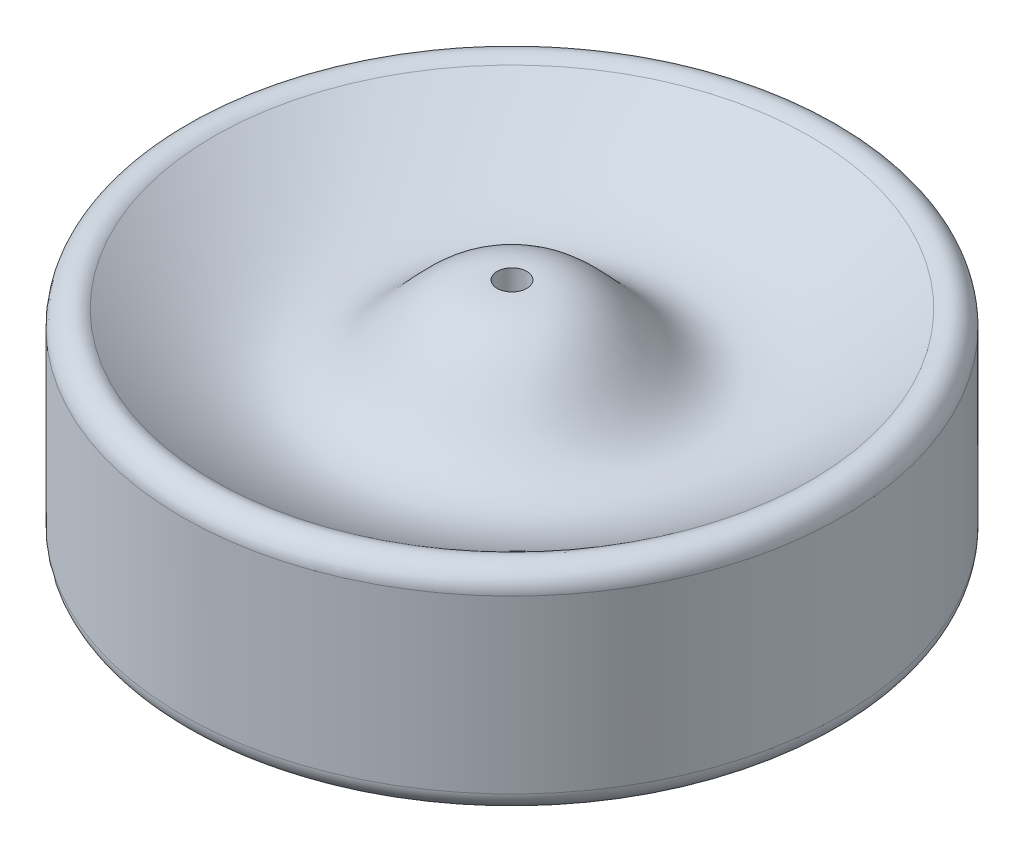
ISO-10303-21;
HEADER;
FILE_DESCRIPTION(('STEP AP214'),'2;1');
FILE_NAME('part.step','',(''),(''),'','','');
FILE_SCHEMA(('AUTOMOTIVE_DESIGN { 1 0 10303 214 1 1 1 1 }'));
ENDSEC;
DATA;
#1=APPLICATION_CONTEXT('core data for automotive mechanical design processes');
#2=APPLICATION_PROTOCOL_DEFINITION('international standard','automotive_design',2000,#1);
#3=PRODUCT_CONTEXT('',#1,'mechanical');
#4=PRODUCT('Part','Part','',(#3));
#5=PRODUCT_RELATED_PRODUCT_CATEGORY('part','',(#4));
#6=PRODUCT_DEFINITION_FORMATION('','',#4);
#7=PRODUCT_DEFINITION_CONTEXT('part definition',#1,'design');
#8=PRODUCT_DEFINITION('design','',#6,#7);
#9=PRODUCT_DEFINITION_SHAPE('','',#8);
#10=(LENGTH_UNIT() NAMED_UNIT(*) SI_UNIT(.MILLI.,.METRE.));
#11=(NAMED_UNIT(*) PLANE_ANGLE_UNIT() SI_UNIT($,.RADIAN.));
#12=(NAMED_UNIT(*) SI_UNIT($,.STERADIAN.) SOLID_ANGLE_UNIT());
#13=UNCERTAINTY_MEASURE_WITH_UNIT(LENGTH_MEASURE(1.E-05),#10,'distance_accuracy_value','');
#14=(GEOMETRIC_REPRESENTATION_CONTEXT(3) GLOBAL_UNCERTAINTY_ASSIGNED_CONTEXT((#13)) GLOBAL_UNIT_ASSIGNED_CONTEXT((#10,
#11,#12)) REPRESENTATION_CONTEXT('',''));
#15=CARTESIAN_POINT('',(0.,0.,0.));
#16=DIRECTION('',(0.,0.,1.));
#17=DIRECTION('',(1.,0.,0.));
#18=AXIS2_PLACEMENT_3D('',#15,#16,#17);
#19=CARTESIAN_POINT('',(0.,0.,0.));
#20=DIRECTION('',(0.,-1.,0.));
#21=DIRECTION('',(0.,0.,-1.));
#22=AXIS2_PLACEMENT_3D('',#19,#20,#21);
#23=PLANE('',#22);
#24=CARTESIAN_POINT('',(0.,0.,0.));
#25=DIRECTION('',(0.,-1.,0.));
#26=DIRECTION('',(0.,0.,-1.));
#27=AXIS2_PLACEMENT_3D('',#24,#25,#26);
#28=CIRCLE('',#27,47.);
#29=CARTESIAN_POINT('',(0.,0.,-47.));
#30=VERTEX_POINT('',#29);
#31=EDGE_CURVE('E48',#30,#30,#28,.T.);
#32=ORIENTED_EDGE('',*,*,#31,.T.);
#33=EDGE_LOOP('',(#32));
#34=FACE_BOUND('',#33,.T.);
#35=ADVANCED_FACE('F31',(#34),#23,.T.);
#36=CARTESIAN_POINT('',(0.,0.,0.));
#37=DIRECTION('',(0.,-1.,0.));
#38=DIRECTION('',(0.,0.,-1.));
#39=AXIS2_PLACEMENT_3D('',#36,#37,#38);
#40=CYLINDRICAL_SURFACE('',#39,50.);
#41=CARTESIAN_POINT('',(0.,3.,0.));
#42=DIRECTION('',(0.,-1.,0.));
#43=DIRECTION('',(0.,0.,-1.));
#44=AXIS2_PLACEMENT_3D('',#41,#42,#43);
#45=CIRCLE('',#44,50.);
#46=CARTESIAN_POINT('',(0.,3.,-50.));
#47=VERTEX_POINT('',#46);
#48=EDGE_CURVE('E39',#47,#47,#45,.F.);
#49=ORIENTED_EDGE('',*,*,#48,.T.);
#50=EDGE_LOOP('',(#49));
#51=FACE_BOUND('',#50,.T.);
#52=CARTESIAN_POINT('',(0.,28.9967297983252,0.));
#53=DIRECTION('',(0.,1.,0.));
#54=DIRECTION('',(0.,0.,1.));
#55=AXIS2_PLACEMENT_3D('',#52,#53,#54);
#56=CIRCLE('',#55,50.);
#57=CARTESIAN_POINT('',(0.,28.9967297983252,50.));
#58=VERTEX_POINT('',#57);
#59=EDGE_CURVE('E43',#58,#58,#56,.F.);
#60=ORIENTED_EDGE('',*,*,#59,.T.);
#61=EDGE_LOOP('',(#60));
#62=FACE_BOUND('',#61,.T.);
#63=ADVANCED_FACE('F65',(#51,#62),#40,.T.);
#64=CARTESIAN_POINT('',(50.,35.,0.));
#65=CARTESIAN_POINT('',(11.6563695972552,5.024124105979,0.));
#66=CARTESIAN_POINT('',(20.1906350263026,38.073649127859,0.));
#67=CARTESIAN_POINT('',(0.,35.,0.));
#68=B_SPLINE_CURVE_WITH_KNOTS('',3,(#64,#65,#66,#67),.UNSPECIFIED.,.F.,.F.,(4,4),(0.,1.),.UNSPECIFIED.);
#69=CARTESIAN_POINT('',(0.,0.,0.));
#70=DIRECTION('',(0.,-1.,0.));
#71=AXIS1_PLACEMENT('',#69,#70);
#72=SURFACE_OF_REVOLUTION('',#68,#71);
#73=CARTESIAN_POINT('',(0.,35.2009833591358,0.));
#74=DIRECTION('',(0.,-1.,0.));
#75=DIRECTION('',(0.,0.,-1.));
#76=AXIS2_PLACEMENT_3D('',#73,#74,#75);
#77=CIRCLE('',#76,2.25000000000001);
#78=CARTESIAN_POINT('',(0.,35.2009833591358,-2.25000000000001));
#79=VERTEX_POINT('',#78);
#80=EDGE_CURVE('E35',#79,#79,#77,.F.);
#81=ORIENTED_EDGE('',*,*,#80,.F.);
#82=EDGE_LOOP('',(#81));
#83=FACE_BOUND('',#82,.T.);
#84=CARTESIAN_POINT('',(0.,31.4345567671296,0.));
#85=DIRECTION('',(0.,-1.,0.));
#86=DIRECTION('',(0.,0.,-1.));
#87=AXIS2_PLACEMENT_3D('',#84,#85,#86);
#88=CIRCLE('',#87,45.2515722290669);
#89=CARTESIAN_POINT('',(0.,31.4345567671296,-45.2515722290669));
#90=VERTEX_POINT('',#89);
#91=EDGE_CURVE('E10',#90,#90,#88,.F.);
#92=ORIENTED_EDGE('',*,*,#91,.T.);
#93=EDGE_LOOP('',(#92));
#94=FACE_BOUND('',#93,.T.);
#95=ADVANCED_FACE('F60',(#83,#94),#72,.F.);
#96=CARTESIAN_POINT('',(0.,3.,0.));
#97=DIRECTION('',(0.,-1.,0.));
#98=DIRECTION('',(0.,0.,-1.));
#99=AXIS2_PLACEMENT_3D('',#96,#97,#98);
#100=TOROIDAL_SURFACE('',#99,47.,3.);
#101=ORIENTED_EDGE('',*,*,#48,.F.);
#102=EDGE_LOOP('',(#101));
#103=FACE_BOUND('',#102,.T.);
#104=ORIENTED_EDGE('',*,*,#31,.F.);
#105=EDGE_LOOP('',(#104));
#106=FACE_BOUND('',#105,.T.);
#107=ADVANCED_FACE('F64',(#103,#106),#100,.T.);
#108=CARTESIAN_POINT('',(0.,28.9967297983252,0.));
#109=DIRECTION('',(0.,1.,0.));
#110=DIRECTION('',(0.,0.,1.));
#111=AXIS2_PLACEMENT_3D('',#108,#109,#110);
#112=TOROIDAL_SURFACE('',#111,47.,3.);
#113=ORIENTED_EDGE('',*,*,#91,.F.);
#114=EDGE_LOOP('',(#113));
#115=FACE_BOUND('',#114,.T.);
#116=ORIENTED_EDGE('',*,*,#59,.F.);
#117=EDGE_LOOP('',(#116));
#118=FACE_BOUND('',#117,.T.);
#119=ADVANCED_FACE('F33',(#115,#118),#112,.T.);
#120=CARTESIAN_POINT('',(0.,20.,0.));
#121=DIRECTION('',(0.,1.,0.));
#122=DIRECTION('',(0.,0.,1.));
#123=AXIS2_PLACEMENT_3D('',#120,#121,#122);
#124=CYLINDRICAL_SURFACE('',#123,2.25);
#125=ORIENTED_EDGE('',*,*,#80,.T.);
#126=EDGE_LOOP('',(#125));
#127=FACE_BOUND('',#126,.T.);
#128=CARTESIAN_POINT('',(0.,20.,0.));
#129=DIRECTION('',(0.,1.,0.));
#130=DIRECTION('',(0.,0.,1.));
#131=AXIS2_PLACEMENT_3D('',#128,#129,#130);
#132=CIRCLE('',#131,2.25);
#133=CARTESIAN_POINT('',(0.,20.,2.25));
#134=VERTEX_POINT('',#133);
#135=EDGE_CURVE('E55',#134,#134,#132,.T.);
#136=ORIENTED_EDGE('',*,*,#135,.F.);
#137=EDGE_LOOP('',(#136));
#138=FACE_BOUND('',#137,.T.);
#139=ADVANCED_FACE('F67',(#127,#138),#124,.F.);
#140=CARTESIAN_POINT('',(0.,20.,0.));
#141=DIRECTION('',(0.,1.,0.));
#142=DIRECTION('',(0.,0.,1.));
#143=AXIS2_PLACEMENT_3D('',#140,#141,#142);
#144=PLANE('',#143);
#145=ORIENTED_EDGE('',*,*,#135,.T.);
#146=EDGE_LOOP('',(#145));
#147=FACE_BOUND('',#146,.T.);
#148=ADVANCED_FACE('F89',(#147),#144,.T.);
#149=CLOSED_SHELL('',(#35,#63,#95,#107,#119,#139,#148));
#150=MANIFOLD_SOLID_BREP('B2',#149);
#151=ADVANCED_BREP_SHAPE_REPRESENTATION('',(#18,#150),#14);
#152=SHAPE_DEFINITION_REPRESENTATION(#9,#151);
ENDSEC;
END-ISO-10303-21;
